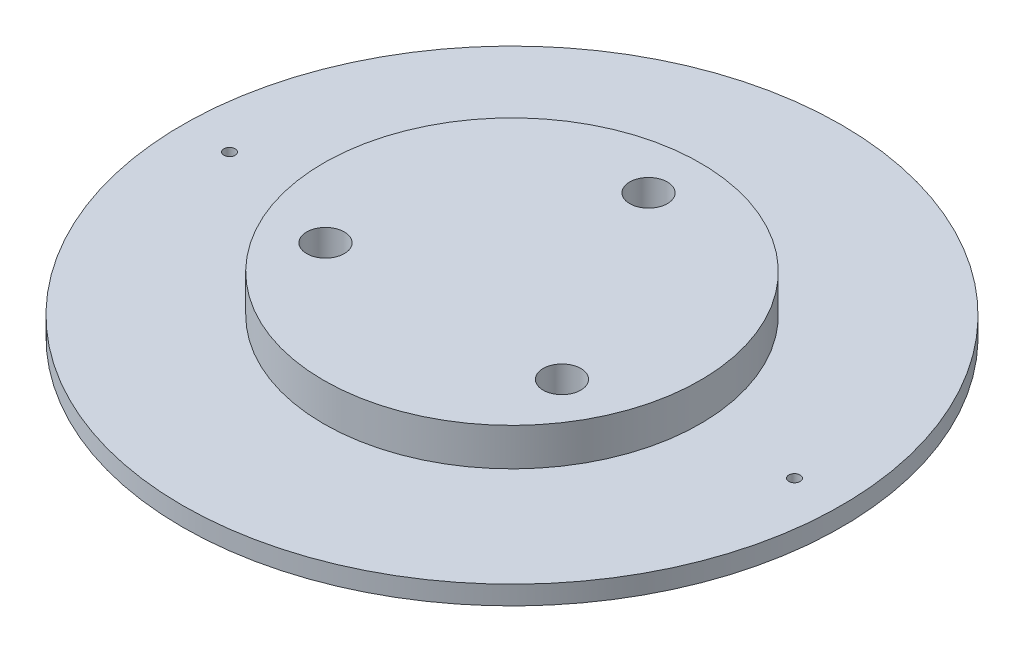
ISO-10303-21;
HEADER;
FILE_DESCRIPTION(('STEP AP214'),'2;1');
FILE_NAME('part.step','',(''),(''),'','','');
FILE_SCHEMA(('AUTOMOTIVE_DESIGN { 1 0 10303 214 1 1 1 1 }'));
ENDSEC;
DATA;
#1=APPLICATION_CONTEXT('core data for automotive mechanical design processes');
#2=APPLICATION_PROTOCOL_DEFINITION('international standard','automotive_design',2000,#1);
#3=PRODUCT_CONTEXT('',#1,'mechanical');
#4=PRODUCT('Part','Part','',(#3));
#5=PRODUCT_RELATED_PRODUCT_CATEGORY('part','',(#4));
#6=PRODUCT_DEFINITION_FORMATION('','',#4);
#7=PRODUCT_DEFINITION_CONTEXT('part definition',#1,'design');
#8=PRODUCT_DEFINITION('design','',#6,#7);
#9=PRODUCT_DEFINITION_SHAPE('','',#8);
#10=(LENGTH_UNIT() NAMED_UNIT(*) SI_UNIT(.MILLI.,.METRE.));
#11=(NAMED_UNIT(*) PLANE_ANGLE_UNIT() SI_UNIT($,.RADIAN.));
#12=(NAMED_UNIT(*) SI_UNIT($,.STERADIAN.) SOLID_ANGLE_UNIT());
#13=UNCERTAINTY_MEASURE_WITH_UNIT(LENGTH_MEASURE(1.E-05),#10,'distance_accuracy_value','');
#14=(GEOMETRIC_REPRESENTATION_CONTEXT(3) GLOBAL_UNCERTAINTY_ASSIGNED_CONTEXT((#13)) GLOBAL_UNIT_ASSIGNED_CONTEXT((#10,
#11,#12)) REPRESENTATION_CONTEXT('',''));
#15=CARTESIAN_POINT('',(0.,0.,0.));
#16=DIRECTION('',(0.,0.,1.));
#17=DIRECTION('',(1.,0.,0.));
#18=AXIS2_PLACEMENT_3D('',#15,#16,#17);
#19=CARTESIAN_POINT('',(0.,20.,0.));
#20=DIRECTION('',(0.,1.,0.));
#21=DIRECTION('',(0.,0.,1.));
#22=AXIS2_PLACEMENT_3D('',#19,#20,#21);
#23=PLANE('',#22);
#24=CARTESIAN_POINT('',(62.7868417743721,20.,36.2499999999994));
#25=DIRECTION('',(0.,1.,0.));
#26=DIRECTION('',(0.,0.,1.));
#27=AXIS2_PLACEMENT_3D('',#24,#25,#26);
#28=CIRCLE('',#27,9.99999999999999);
#29=CARTESIAN_POINT('',(62.7868417743721,20.,46.2499999999994));
#30=VERTEX_POINT('',#29);
#31=EDGE_CURVE('E56',#30,#30,#28,.T.);
#32=ORIENTED_EDGE('',*,*,#31,.F.);
#33=EDGE_LOOP('',(#32));
#34=FACE_BOUND('',#33,.T.);
#35=CARTESIAN_POINT('',(0.,20.,0.));
#36=DIRECTION('',(0.,1.,0.));
#37=DIRECTION('',(0.,0.,1.));
#38=AXIS2_PLACEMENT_3D('',#35,#36,#37);
#39=CIRCLE('',#38,100.);
#40=CARTESIAN_POINT('',(0.,20.,100.));
#41=VERTEX_POINT('',#40);
#42=EDGE_CURVE('E10',#41,#41,#39,.T.);
#43=ORIENTED_EDGE('',*,*,#42,.T.);
#44=EDGE_LOOP('',(#43));
#45=FACE_BOUND('',#44,.T.);
#46=CARTESIAN_POINT('',(0.,20.,-72.5));
#47=DIRECTION('',(0.,1.,0.));
#48=DIRECTION('',(0.,0.,1.));
#49=AXIS2_PLACEMENT_3D('',#46,#47,#48);
#50=CIRCLE('',#49,9.99999999999999);
#51=CARTESIAN_POINT('',(0.,20.,-62.5));
#52=VERTEX_POINT('',#51);
#53=EDGE_CURVE('E46',#52,#52,#50,.T.);
#54=ORIENTED_EDGE('',*,*,#53,.F.);
#55=EDGE_LOOP('',(#54));
#56=FACE_BOUND('',#55,.T.);
#57=CARTESIAN_POINT('',(-62.7868417743716,20.,36.2500000000003));
#58=DIRECTION('',(0.,1.,0.));
#59=DIRECTION('',(0.,0.,1.));
#60=AXIS2_PLACEMENT_3D('',#57,#58,#59);
#61=CIRCLE('',#60,10.);
#62=CARTESIAN_POINT('',(-62.7868417743716,20.,46.2500000000003));
#63=VERTEX_POINT('',#62);
#64=EDGE_CURVE('E62',#63,#63,#61,.T.);
#65=ORIENTED_EDGE('',*,*,#64,.F.);
#66=EDGE_LOOP('',(#65));
#67=FACE_BOUND('',#66,.T.);
#68=ADVANCED_FACE('F37',(#34,#45,#56,#67),#23,.T.);
#69=CARTESIAN_POINT('',(0.,20.,0.));
#70=DIRECTION('',(0.,-1.,0.));
#71=DIRECTION('',(0.,0.,-1.));
#72=AXIS2_PLACEMENT_3D('',#69,#70,#71);
#73=CYLINDRICAL_SURFACE('',#72,100.);
#74=ORIENTED_EDGE('',*,*,#42,.F.);
#75=EDGE_LOOP('',(#74));
#76=FACE_BOUND('',#75,.T.);
#77=CARTESIAN_POINT('',(0.,0.,0.));
#78=DIRECTION('',(0.,1.,0.));
#79=DIRECTION('',(0.,0.,1.));
#80=AXIS2_PLACEMENT_3D('',#77,#78,#79);
#81=CIRCLE('',#80,100.);
#82=CARTESIAN_POINT('',(0.,0.,100.));
#83=VERTEX_POINT('',#82);
#84=EDGE_CURVE('E41',#83,#83,#81,.T.);
#85=ORIENTED_EDGE('',*,*,#84,.T.);
#86=EDGE_LOOP('',(#85));
#87=FACE_BOUND('',#86,.T.);
#88=ADVANCED_FACE('F39',(#76,#87),#73,.T.);
#89=CARTESIAN_POINT('',(0.,20.,-72.5));
#90=DIRECTION('',(0.,-1.,0.));
#91=DIRECTION('',(0.,0.,-1.));
#92=AXIS2_PLACEMENT_3D('',#89,#90,#91);
#93=CYLINDRICAL_SURFACE('',#92,9.99999999999999);
#94=ORIENTED_EDGE('',*,*,#53,.T.);
#95=EDGE_LOOP('',(#94));
#96=FACE_BOUND('',#95,.T.);
#97=CARTESIAN_POINT('',(0.,0.,-72.5));
#98=DIRECTION('',(0.,1.,0.));
#99=DIRECTION('',(0.,0.,1.));
#100=AXIS2_PLACEMENT_3D('',#97,#98,#99);
#101=CIRCLE('',#100,9.99999999999999);
#102=CARTESIAN_POINT('',(0.,0.,-62.5));
#103=VERTEX_POINT('',#102);
#104=EDGE_CURVE('E51',#103,#103,#101,.T.);
#105=ORIENTED_EDGE('',*,*,#104,.F.);
#106=EDGE_LOOP('',(#105));
#107=FACE_BOUND('',#106,.T.);
#108=ADVANCED_FACE('F125',(#96,#107),#93,.F.);
#109=CARTESIAN_POINT('',(62.7868417743721,20.,36.2499999999994));
#110=DIRECTION('',(0.,-1.,0.));
#111=DIRECTION('',(0.,0.,-1.));
#112=AXIS2_PLACEMENT_3D('',#109,#110,#111);
#113=CYLINDRICAL_SURFACE('',#112,9.99999999999999);
#114=ORIENTED_EDGE('',*,*,#31,.T.);
#115=EDGE_LOOP('',(#114));
#116=FACE_BOUND('',#115,.T.);
#117=CARTESIAN_POINT('',(62.7868417743721,0.,36.2499999999994));
#118=DIRECTION('',(0.,1.,0.));
#119=DIRECTION('',(0.,0.,1.));
#120=AXIS2_PLACEMENT_3D('',#117,#118,#119);
#121=CIRCLE('',#120,9.99999999999999);
#122=CARTESIAN_POINT('',(62.7868417743721,0.,46.2499999999994));
#123=VERTEX_POINT('',#122);
#124=EDGE_CURVE('E58',#123,#123,#121,.T.);
#125=ORIENTED_EDGE('',*,*,#124,.F.);
#126=EDGE_LOOP('',(#125));
#127=FACE_BOUND('',#126,.T.);
#128=ADVANCED_FACE('F131',(#116,#127),#113,.F.);
#129=CARTESIAN_POINT('',(-62.7868417743716,20.,36.2500000000003));
#130=DIRECTION('',(0.,-1.,0.));
#131=DIRECTION('',(0.,0.,-1.));
#132=AXIS2_PLACEMENT_3D('',#129,#130,#131);
#133=CYLINDRICAL_SURFACE('',#132,10.);
#134=ORIENTED_EDGE('',*,*,#64,.T.);
#135=EDGE_LOOP('',(#134));
#136=FACE_BOUND('',#135,.T.);
#137=CARTESIAN_POINT('',(-62.7868417743716,0.,36.2500000000003));
#138=DIRECTION('',(0.,1.,0.));
#139=DIRECTION('',(0.,0.,1.));
#140=AXIS2_PLACEMENT_3D('',#137,#138,#139);
#141=CIRCLE('',#140,10.);
#142=CARTESIAN_POINT('',(-62.7868417743716,0.,46.2500000000003));
#143=VERTEX_POINT('',#142);
#144=EDGE_CURVE('E66',#143,#143,#141,.T.);
#145=ORIENTED_EDGE('',*,*,#144,.F.);
#146=EDGE_LOOP('',(#145));
#147=FACE_BOUND('',#146,.T.);
#148=ADVANCED_FACE('F135',(#136,#147),#133,.F.);
#149=CARTESIAN_POINT('',(0.,0.,0.));
#150=DIRECTION('',(0.,-1.,0.));
#151=DIRECTION('',(0.,0.,-1.));
#152=AXIS2_PLACEMENT_3D('',#149,#150,#151);
#153=PLANE('',#152);
#154=ORIENTED_EDGE('',*,*,#144,.T.);
#155=EDGE_LOOP('',(#154));
#156=FACE_BOUND('',#155,.T.);
#157=ADVANCED_FACE('F114',(#156),#153,.F.);
#158=ORIENTED_EDGE('',*,*,#124,.T.);
#159=EDGE_LOOP('',(#158));
#160=FACE_BOUND('',#159,.T.);
#161=ADVANCED_FACE('F115',(#160),#153,.F.);
#162=ORIENTED_EDGE('',*,*,#104,.T.);
#163=EDGE_LOOP('',(#162));
#164=FACE_BOUND('',#163,.T.);
#165=ADVANCED_FACE('F104',(#164),#153,.F.);
#166=CARTESIAN_POINT('',(0.,-10.,0.));
#167=DIRECTION('',(0.,-1.,0.));
#168=DIRECTION('',(0.,0.,-1.));
#169=AXIS2_PLACEMENT_3D('',#166,#167,#168);
#170=PLANE('',#169);
#171=CARTESIAN_POINT('',(-150.,-10.,0.));
#172=DIRECTION('',(0.,-1.,0.));
#173=DIRECTION('',(0.,0.,-1.));
#174=AXIS2_PLACEMENT_3D('',#171,#172,#173);
#175=CIRCLE('',#174,2.99999999999999);
#176=CARTESIAN_POINT('',(-150.,-10.,-2.99999999999999));
#177=VERTEX_POINT('',#176);
#178=EDGE_CURVE('E78',#177,#177,#175,.T.);
#179=ORIENTED_EDGE('',*,*,#178,.F.);
#180=EDGE_LOOP('',(#179));
#181=FACE_BOUND('',#180,.T.);
#182=CARTESIAN_POINT('',(0.,-10.,0.));
#183=DIRECTION('',(0.,-1.,0.));
#184=DIRECTION('',(0.,0.,-1.));
#185=AXIS2_PLACEMENT_3D('',#182,#183,#184);
#186=CIRCLE('',#185,175.);
#187=CARTESIAN_POINT('',(0.,-10.,-175.));
#188=VERTEX_POINT('',#187);
#189=EDGE_CURVE('E77',#188,#188,#186,.T.);
#190=ORIENTED_EDGE('',*,*,#189,.T.);
#191=EDGE_LOOP('',(#190));
#192=FACE_BOUND('',#191,.T.);
#193=CARTESIAN_POINT('',(150.,-10.,0.));
#194=DIRECTION('',(0.,-1.,0.));
#195=DIRECTION('',(0.,0.,-1.));
#196=AXIS2_PLACEMENT_3D('',#193,#194,#195);
#197=CIRCLE('',#196,2.99999999999999);
#198=CARTESIAN_POINT('',(150.,-10.,-2.99999999999994));
#199=VERTEX_POINT('',#198);
#200=EDGE_CURVE('E86',#199,#199,#197,.T.);
#201=ORIENTED_EDGE('',*,*,#200,.F.);
#202=EDGE_LOOP('',(#201));
#203=FACE_BOUND('',#202,.T.);
#204=ADVANCED_FACE('F101',(#181,#192,#203),#170,.T.);
#205=ORIENTED_EDGE('',*,*,#84,.F.);
#206=EDGE_LOOP('',(#205));
#207=FACE_BOUND('',#206,.T.);
#208=CARTESIAN_POINT('',(0.,0.,0.));
#209=DIRECTION('',(0.,-1.,0.));
#210=DIRECTION('',(0.,0.,-1.));
#211=AXIS2_PLACEMENT_3D('',#208,#209,#210);
#212=CIRCLE('',#211,175.);
#213=CARTESIAN_POINT('',(0.,0.,-175.));
#214=VERTEX_POINT('',#213);
#215=EDGE_CURVE('E73',#214,#214,#212,.T.);
#216=ORIENTED_EDGE('',*,*,#215,.F.);
#217=EDGE_LOOP('',(#216));
#218=FACE_BOUND('',#217,.T.);
#219=CARTESIAN_POINT('',(-150.,0.,0.));
#220=DIRECTION('',(0.,-1.,0.));
#221=DIRECTION('',(0.,0.,-1.));
#222=AXIS2_PLACEMENT_3D('',#219,#220,#221);
#223=CIRCLE('',#222,2.99999999999999);
#224=CARTESIAN_POINT('',(-150.,0.,-2.99999999999999));
#225=VERTEX_POINT('',#224);
#226=EDGE_CURVE('E82',#225,#225,#223,.T.);
#227=ORIENTED_EDGE('',*,*,#226,.T.);
#228=EDGE_LOOP('',(#227));
#229=FACE_BOUND('',#228,.T.);
#230=CARTESIAN_POINT('',(150.,0.,0.));
#231=DIRECTION('',(0.,-1.,0.));
#232=DIRECTION('',(0.,0.,-1.));
#233=AXIS2_PLACEMENT_3D('',#230,#231,#232);
#234=CIRCLE('',#233,2.99999999999999);
#235=CARTESIAN_POINT('',(150.,0.,-2.99999999999994));
#236=VERTEX_POINT('',#235);
#237=EDGE_CURVE('E90',#236,#236,#234,.T.);
#238=ORIENTED_EDGE('',*,*,#237,.T.);
#239=EDGE_LOOP('',(#238));
#240=FACE_BOUND('',#239,.T.);
#241=ADVANCED_FACE('F103',(#207,#218,#229,#240),#153,.F.);
#242=CARTESIAN_POINT('',(0.,-10.,0.));
#243=DIRECTION('',(0.,1.,0.));
#244=DIRECTION('',(0.,0.,1.));
#245=AXIS2_PLACEMENT_3D('',#242,#243,#244);
#246=CYLINDRICAL_SURFACE('',#245,175.);
#247=ORIENTED_EDGE('',*,*,#189,.F.);
#248=EDGE_LOOP('',(#247));
#249=FACE_BOUND('',#248,.T.);
#250=ORIENTED_EDGE('',*,*,#215,.T.);
#251=EDGE_LOOP('',(#250));
#252=FACE_BOUND('',#251,.T.);
#253=ADVANCED_FACE('F111',(#249,#252),#246,.T.);
#254=CARTESIAN_POINT('',(-150.,-10.,0.));
#255=DIRECTION('',(0.,1.,0.));
#256=DIRECTION('',(0.,0.,1.));
#257=AXIS2_PLACEMENT_3D('',#254,#255,#256);
#258=CYLINDRICAL_SURFACE('',#257,2.99999999999999);
#259=ORIENTED_EDGE('',*,*,#178,.T.);
#260=EDGE_LOOP('',(#259));
#261=FACE_BOUND('',#260,.T.);
#262=ORIENTED_EDGE('',*,*,#226,.F.);
#263=EDGE_LOOP('',(#262));
#264=FACE_BOUND('',#263,.T.);
#265=ADVANCED_FACE('F141',(#261,#264),#258,.F.);
#266=CARTESIAN_POINT('',(150.,-10.,0.));
#267=DIRECTION('',(0.,1.,0.));
#268=DIRECTION('',(0.,0.,1.));
#269=AXIS2_PLACEMENT_3D('',#266,#267,#268);
#270=CYLINDRICAL_SURFACE('',#269,2.99999999999999);
#271=ORIENTED_EDGE('',*,*,#200,.T.);
#272=EDGE_LOOP('',(#271));
#273=FACE_BOUND('',#272,.T.);
#274=ORIENTED_EDGE('',*,*,#237,.F.);
#275=EDGE_LOOP('',(#274));
#276=FACE_BOUND('',#275,.T.);
#277=ADVANCED_FACE('F98',(#273,#276),#270,.F.);
#278=CLOSED_SHELL('',(#68,#88,#108,#128,#148,#157,#161,#165,#204,#241,#253,#265,#277));
#279=MANIFOLD_SOLID_BREP('B2',#278);
#280=ADVANCED_BREP_SHAPE_REPRESENTATION('',(#18,#279),#14);
#281=SHAPE_DEFINITION_REPRESENTATION(#9,#280);
ENDSEC;
END-ISO-10303-21;
